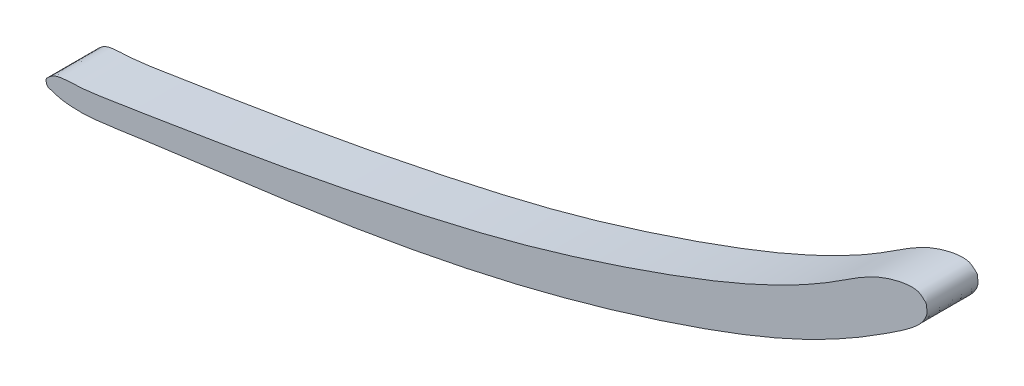
ISO-10303-21;
HEADER;
FILE_DESCRIPTION(('STEP AP214'),'2;1');
FILE_NAME('part.step','',(''),(''),'','','');
FILE_SCHEMA(('AUTOMOTIVE_DESIGN { 1 0 10303 214 1 1 1 1 }'));
ENDSEC;
DATA;
#1=APPLICATION_CONTEXT('core data for automotive mechanical design processes');
#2=APPLICATION_PROTOCOL_DEFINITION('international standard','automotive_design',2000,#1);
#3=PRODUCT_CONTEXT('',#1,'mechanical');
#4=PRODUCT('Part','Part','',(#3));
#5=PRODUCT_RELATED_PRODUCT_CATEGORY('part','',(#4));
#6=PRODUCT_DEFINITION_FORMATION('','',#4);
#7=PRODUCT_DEFINITION_CONTEXT('part definition',#1,'design');
#8=PRODUCT_DEFINITION('design','',#6,#7);
#9=PRODUCT_DEFINITION_SHAPE('','',#8);
#10=(LENGTH_UNIT() NAMED_UNIT(*) SI_UNIT(.MILLI.,.METRE.));
#11=(NAMED_UNIT(*) PLANE_ANGLE_UNIT() SI_UNIT($,.RADIAN.));
#12=(NAMED_UNIT(*) SI_UNIT($,.STERADIAN.) SOLID_ANGLE_UNIT());
#13=UNCERTAINTY_MEASURE_WITH_UNIT(LENGTH_MEASURE(1.E-05),#10,'distance_accuracy_value','');
#14=(GEOMETRIC_REPRESENTATION_CONTEXT(3) GLOBAL_UNCERTAINTY_ASSIGNED_CONTEXT((#13)) GLOBAL_UNIT_ASSIGNED_CONTEXT((#10,
#11,#12)) REPRESENTATION_CONTEXT('',''));
#15=CARTESIAN_POINT('',(0.,0.,0.));
#16=DIRECTION('',(0.,0.,1.));
#17=DIRECTION('',(1.,0.,0.));
#18=AXIS2_PLACEMENT_3D('',#15,#16,#17);
#19=CARTESIAN_POINT('',(83.4912121583516,0.,308.));
#20=CARTESIAN_POINT('',(83.4532867798643,0.0909827646871946,308.));
#21=CARTESIAN_POINT('',(83.3846794221663,0.16157354240682,308.));
#22=CARTESIAN_POINT('',(83.242684122017,0.294381657921899,308.));
#23=CARTESIAN_POINT('',(83.1678538136841,0.356403779828761,308.));
#24=CARTESIAN_POINT('',(82.9472739637766,0.54694173654499,308.));
#25=CARTESIAN_POINT('',(82.8005563729602,0.676143974114221,308.));
#26=CARTESIAN_POINT('',(82.5625786490889,0.840871096492843,308.));
#27=CARTESIAN_POINT('',(82.4806961712847,0.891315206210077,308.));
#28=CARTESIAN_POINT('',(82.3077924977375,0.976243077147167,308.));
#29=CARTESIAN_POINT('',(82.2163311983857,1.0114291448976,308.));
#30=CARTESIAN_POINT('',(81.9358143355176,1.09581030373006,308.));
#31=CARTESIAN_POINT('',(81.7448100150683,1.12364353775783,308.));
#32=CARTESIAN_POINT('',(81.3589412831867,1.15183567737865,308.));
#33=CARTESIAN_POINT('',(81.1635581628754,1.15129929875423,308.));
#34=CARTESIAN_POINT('',(80.7775015296282,1.13603456985938,308.));
#35=CARTESIAN_POINT('',(80.5857067633743,1.12072480895572,308.));
#36=CARTESIAN_POINT('',(80.0136099817647,1.05433460859319,308.));
#37=CARTESIAN_POINT('',(79.6363021866825,0.984618678696754,308.));
#38=CARTESIAN_POINT('',(78.5102545404211,0.738901342460389,308.));
#39=CARTESIAN_POINT('',(77.7670339215163,0.51971837554762,308.));
#40=CARTESIAN_POINT('',(76.3276338511136,0.0059361056997283,308.));
#41=CARTESIAN_POINT('',(75.6277711215128,-0.292402598144494,308.));
#42=CARTESIAN_POINT('',(73.5848403216414,-1.30579723748026,308.));
#43=CARTESIAN_POINT('',(72.2928251707021,-2.12852064267373,308.));
#44=CARTESIAN_POINT('',(70.3640923257504,-3.37826596528115,308.));
#45=CARTESIAN_POINT('',(69.7218398830231,-3.79603143214602,308.));
#46=CARTESIAN_POINT('',(68.4288297865576,-4.61627387627075,308.));
#47=CARTESIAN_POINT('',(67.7787063329545,-5.01989085607263,308.));
#48=CARTESIAN_POINT('',(65.8091934294524,-6.19633223590341,308.));
#49=CARTESIAN_POINT('',(64.471753997392,-6.93671100180345,308.));
#50=CARTESIAN_POINT('',(61.7645519748151,-8.35936623944189,308.));
#51=CARTESIAN_POINT('',(60.3948167823874,-9.04169196044595,308.));
#52=CARTESIAN_POINT('',(57.6308469516567,-10.3623045745968,308.));
#53=CARTESIAN_POINT('',(56.2357991547441,-10.999424696263,308.));
#54=CARTESIAN_POINT('',(53.4273757692444,-12.2263913630353,308.));
#55=CARTESIAN_POINT('',(52.0134629516053,-12.8172282177283,308.));
#56=CARTESIAN_POINT('',(47.7487805717884,-14.5361780702807,308.));
#57=CARTESIAN_POINT('',(44.8798601965009,-15.6143187369691,308.));
#58=CARTESIAN_POINT('',(39.1122570987183,-17.6850859041681,308.));
#59=CARTESIAN_POINT('',(36.2116700142817,-18.6755855898626,308.));
#60=CARTESIAN_POINT('',(30.3858465663811,-20.5815670559842,308.));
#61=CARTESIAN_POINT('',(27.4615814530534,-21.497054940903,308.));
#62=CARTESIAN_POINT('',(21.5826340377719,-23.2275557628624,308.));
#63=CARTESIAN_POINT('',(18.6259302562351,-24.0393737655911,308.));
#64=CARTESIAN_POINT('',(12.6875397694457,-25.557094362804,308.));
#65=CARTESIAN_POINT('',(9.70560086263767,-26.2629716215502,308.));
#66=CARTESIAN_POINT('',(3.72721901976077,-27.6144242042274,308.));
#67=CARTESIAN_POINT('',(0.731194282338575,-28.262039310148,308.));
#68=CARTESIAN_POINT('',(-5.26852693935508,-29.5166454734456,308.));
#69=CARTESIAN_POINT('',(-8.27266366830629,-30.1230698458666,308.));
#70=CARTESIAN_POINT('',(-14.2907326274072,-31.2880907673726,308.));
#71=CARTESIAN_POINT('',(-17.3049274544902,-31.8437250730409,308.));
#72=CARTESIAN_POINT('',(-23.3410594299745,-32.9091148353466,308.));
#73=CARTESIAN_POINT('',(-26.3631067398818,-33.4193294407733,308.));
#74=CARTESIAN_POINT('',(-32.4108122633203,-34.4189874004794,308.));
#75=CARTESIAN_POINT('',(-35.4360718893338,-34.9102743820847,308.));
#76=CARTESIAN_POINT('',(-39.974815344507,-35.6418487208219,308.));
#77=CARTESIAN_POINT('',(-41.4880932417012,-35.8834803456351,308.));
#78=CARTESIAN_POINT('',(-43.759273039026,-36.2378378889827,308.));
#79=CARTESIAN_POINT('',(-44.516407745779,-36.3556243519962,308.));
#80=CARTESIAN_POINT('',(-46.0312473730212,-36.5868956813561,308.));
#81=CARTESIAN_POINT('',(-46.7892314253596,-36.6980755522116,308.));
#82=CARTESIAN_POINT('',(-48.3104616886796,-36.8788800208307,308.));
#83=CARTESIAN_POINT('',(-49.074202318415,-36.9490838847295,308.));
#84=CARTESIAN_POINT('',(-50.2224458418687,-37.0125138057084,308.));
#85=CARTESIAN_POINT('',(-50.6057290776168,-37.0253694452461,308.));
#86=CARTESIAN_POINT('',(-51.3711920766601,-37.0681619813778,308.));
#87=CARTESIAN_POINT('',(-51.7547561780958,-37.0982580050029,308.));
#88=CARTESIAN_POINT('',(-52.5114335024971,-37.2110337131133,308.));
#89=CARTESIAN_POINT('',(-52.8834776932882,-37.2928218381232,308.));
#90=CARTESIAN_POINT('',(-53.4125215026299,-37.5326193046912,308.));
#91=CARTESIAN_POINT('',(-53.5768827998733,-37.6331800756411,308.));
#92=CARTESIAN_POINT('',(-53.8868382805185,-37.8590768028461,308.));
#93=CARTESIAN_POINT('',(-54.0325250055758,-37.9861044967327,308.));
#94=CARTESIAN_POINT('',(-54.2479678102837,-38.179433462166,308.));
#95=CARTESIAN_POINT('',(-54.3191791330717,-38.2452738072848,308.));
#96=CARTESIAN_POINT('',(-54.4109669434364,-38.3565605321139,308.));
#97=CARTESIAN_POINT('',(-54.4389626363028,-38.3968909239866,308.));
#98=CARTESIAN_POINT('',(-54.4803634772818,-38.4835778432258,308.));
#99=CARTESIAN_POINT('',(-54.4931513930416,-38.5309334553159,308.));
#100=CARTESIAN_POINT('',(-54.5089633384086,-38.674766840954,308.));
#101=CARTESIAN_POINT('',(-54.4928049582321,-38.7715588624179,308.));
#102=CARTESIAN_POINT('',(-54.4505607179286,-38.9591594213147,308.));
#103=CARTESIAN_POINT('',(-54.4245586866241,-39.0516553652259,308.));
#104=CARTESIAN_POINT('',(-54.353876750655,-39.2316549051913,308.));
#105=CARTESIAN_POINT('',(-54.3058109211606,-39.3186805388238,308.));
#106=CARTESIAN_POINT('',(-54.199236026553,-39.4157474857262,308.));
#107=CARTESIAN_POINT('',(-54.1578695537671,-39.4425281610623,308.));
#108=CARTESIAN_POINT('',(-54.0710014182618,-39.4837803024544,308.));
#109=CARTESIAN_POINT('',(-54.0256839446919,-39.4993087921217,308.));
#110=CARTESIAN_POINT('',(-53.8878046628719,-39.5406790650407,308.));
#111=CARTESIAN_POINT('',(-53.7940462112595,-39.5632355906695,308.));
#112=CARTESIAN_POINT('',(-53.608977924208,-39.615583342901,308.));
#113=CARTESIAN_POINT('',(-53.5169291995519,-39.6433412767754,308.));
#114=CARTESIAN_POINT('',(-53.2422330028295,-39.7313467603524,308.));
#115=CARTESIAN_POINT('',(-53.0605350811076,-39.7946929588388,308.));
#116=CARTESIAN_POINT('',(-52.6934974906335,-39.9095013150421,308.));
#117=CARTESIAN_POINT('',(-52.5075586370712,-39.9603812367597,308.));
#118=CARTESIAN_POINT('',(-51.9483450903296,-40.0860083367176,308.));
#119=CARTESIAN_POINT('',(-51.573056921684,-40.1411659596429,308.));
#120=CARTESIAN_POINT('',(-50.443505887996,-40.2641193016681,308.));
#121=CARTESIAN_POINT('',(-49.6857826012058,-40.2920033464207,308.));
#122=CARTESIAN_POINT('',(-48.1629220922978,-40.2622608843294,308.));
#123=CARTESIAN_POINT('',(-47.402767229354,-40.2054136761593,308.));
#124=CARTESIAN_POINT('',(-45.8884447741612,-40.0553478149949,308.));
#125=CARTESIAN_POINT('',(-45.1330314359489,-39.9620038250949,308.));
#126=CARTESIAN_POINT('',(-42.8689429971,-39.6594317380198,308.));
#127=CARTESIAN_POINT('',(-41.3628949284365,-39.4337340126056,308.));
#128=CARTESIAN_POINT('',(-38.3487495689712,-38.9972049035244,308.));
#129=CARTESIAN_POINT('',(-36.8410102205974,-38.783573147363,308.));
#130=CARTESIAN_POINT('',(-32.3145359869973,-38.165961783561,308.));
#131=CARTESIAN_POINT('',(-29.2935598335747,-37.7794270604682,308.));
#132=CARTESIAN_POINT('',(-23.253327697027,-36.9934450189986,308.));
#133=CARTESIAN_POINT('',(-20.2340008051575,-36.5947942757681,308.));
#134=CARTESIAN_POINT('',(-11.1855052017771,-35.3308181209158,308.));
#135=CARTESIAN_POINT('',(-5.16514856162024,-34.3957324266248,308.));
#136=CARTESIAN_POINT('',(6.82210244976003,-32.2343441177706,308.));
#137=CARTESIAN_POINT('',(12.7918288874873,-31.0116825375032,308.));
#138=CARTESIAN_POINT('',(24.6411024889613,-28.1952028690295,308.));
#139=CARTESIAN_POINT('',(30.5229769583351,-26.6000547169089,308.));
#140=CARTESIAN_POINT('',(39.2655368058489,-23.9517303403162,308.));
#141=CARTESIAN_POINT('',(42.1682945829716,-23.0263253399831,308.));
#142=CARTESIAN_POINT('',(47.9397514871137,-21.0818515816051,308.));
#143=CARTESIAN_POINT('',(50.8090094985958,-20.063536836132,308.));
#144=CARTESIAN_POINT('',(56.4983954011131,-17.8894604379086,308.));
#145=CARTESIAN_POINT('',(59.3188712254982,-16.7339806002398,308.));
#146=CARTESIAN_POINT('',(64.8651421747803,-14.220117865167,308.));
#147=CARTESIAN_POINT('',(67.5937803541576,-12.8579310502215,308.));
#148=CARTESIAN_POINT('',(72.9206979742782,-9.90227392871127,308.));
#149=CARTESIAN_POINT('',(75.5210774526343,-8.30822155483037,308.));
#150=CARTESIAN_POINT('',(78.6985652240814,-6.20797648682437,308.));
#151=CARTESIAN_POINT('',(79.3307531279343,-5.78245732497108,308.));
#152=CARTESIAN_POINT('',(80.2641329435709,-5.12354476219446,308.));
#153=CARTESIAN_POINT('',(80.5721591589305,-4.89963876361314,308.));
#154=CARTESIAN_POINT('',(81.1777314306535,-4.43739815371735,308.));
#155=CARTESIAN_POINT('',(81.4759336351529,-4.19962719259083,308.));
#156=CARTESIAN_POINT('',(82.046862442694,-3.69947237982639,308.));
#157=CARTESIAN_POINT('',(82.3200523191829,-3.43690040978045,308.));
#158=CARTESIAN_POINT('',(82.8242323529913,-2.86880026733135,308.));
#159=CARTESIAN_POINT('',(83.0553932043971,-2.55873934361128,308.));
#160=CARTESIAN_POINT('',(83.3362435841397,-2.06054822060238,308.));
#161=CARTESIAN_POINT('',(83.4199662203601,-1.8881657997926,308.));
#162=CARTESIAN_POINT('',(83.550317346859,-1.52599626875482,308.));
#163=CARTESIAN_POINT('',(83.5963176871067,-1.34084087125222,308.));
#164=CARTESIAN_POINT('',(83.6179017274213,-0.955581607189905,308.));
#165=CARTESIAN_POINT('',(83.590046425675,-0.762839683665189,308.));
#166=CARTESIAN_POINT('',(83.5538014311725,-0.475633865338596,308.));
#167=CARTESIAN_POINT('',(83.5459689093893,-0.37953720168553,308.));
#168=CARTESIAN_POINT('',(83.5321214021614,-0.187189292374469,308.));
#169=CARTESIAN_POINT('',(83.5291375368388,-0.0909827646871832,308.));
#170=CARTESIAN_POINT('',(83.4912121583516,0.,308.));
#171=B_SPLINE_CURVE_WITH_KNOTS('',3,(#19,#20,#21,#22,#23,#24,#25,#26,#27,#28,#29,#30,#31,#32,
#33,#34,#35,#36,#37,#38,#39,#40,#41,#42,#43,#44,#45,#46,#47,#48,#49,#50,#51,#52,#53,#54,#55,#56,
#57,#58,#59,#60,#61,#62,#63,#64,#65,#66,#67,#68,#69,#70,#71,#72,#73,#74,#75,#76,#77,#78,#79,#80,
#81,#82,#83,#84,#85,#86,#87,#88,#89,#90,#91,#92,#93,#94,#95,#96,#97,#98,#99,#100,#101,#102,#103,
#104,#105,#106,#107,#108,#109,#110,#111,#112,#113,#114,#115,#116,#117,#118,#119,#120,#121,#122,
#123,#124,#125,#126,#127,#128,#129,#130,#131,#132,#133,#134,#135,#136,#137,#138,#139,#140,#141,
#142,#143,#144,#145,#146,#147,#148,#149,#150,#151,#152,#153,#154,#155,#156,#157,#158,#159,#160,
#161,#162,#163,#164,#165,#166,#167,#168,#169,#170),.UNSPECIFIED.,.T.,.F.,(4,2,2,2,2,2,2,2,2,2,2,
2,2,2,2,2,2,2,2,2,2,2,2,2,2,2,2,2,2,2,2,2,2,2,2,2,2,2,2,2,2,2,2,2,2,2,2,2,2,2,2,2,2,2,2,2,2,2,2,
2,2,2,2,2,2,2,2,2,2,2,2,2,2,2,2,4),(0.,0.000976562500000131,0.00195312500000026,
0.00390625000000042,0.00488281250000049,0.00585937500000057,0.0078125000000006,
0.00976562500000062,0.0117187500000006,0.0156250000000007,0.0234375000000008,0.0312500000000009,
0.0468750000000012,0.0546875000000013,0.0625000000000015,0.0781250000000019,0.0937500000000024,
0.109375000000003,0.125000000000003,0.156250000000004,0.187500000000005,0.218750000000006,
0.250000000000007,0.281250000000007,0.312500000000008,0.343750000000009,0.37500000000001,
0.406250000000011,0.437500000000011,0.453125000000012,0.460937500000012,0.468750000000012,
0.476562500000012,0.480468750000012,0.484375000000013,0.488281250000013,0.490234375000013,
0.492187500000013,0.493164062500013,0.493652343750013,0.494140625000013,0.495117187500013,
0.496093750000013,0.497070312500013,0.497558593750013,0.498046875000013,0.499023437500013,
0.500000000000013,0.501953125000013,0.503906250000013,0.507812500000013,0.515625000000012,
0.523437500000012,0.531250000000012,0.546875000000012,0.562500000000011,0.593750000000011,
0.62500000000001,0.687500000000008,0.750000000000007,0.812500000000005,0.843750000000004,
0.875000000000003,0.906250000000003,0.937500000000002,0.968750000000001,0.976562500000001,
0.980468750000001,0.984375000000001,0.98828125,0.9921875,0.994140625,0.99609375,0.998046875,
0.9990234375,1.),.UNSPECIFIED.);
#172=DIRECTION('',(0.,0.,-1.));
#173=VECTOR('',#172,1.);
#174=SURFACE_OF_LINEAR_EXTRUSION('',#171,#173);
#175=CARTESIAN_POINT('',(83.4912121583516,0.,308.));
#176=CARTESIAN_POINT('',(83.5291375368388,-0.0909827646871832,308.));
#177=CARTESIAN_POINT('',(83.5321214021614,-0.187189292374469,308.));
#178=CARTESIAN_POINT('',(83.5459689093893,-0.37953720168553,308.));
#179=CARTESIAN_POINT('',(83.5538014311725,-0.475633865338596,308.));
#180=CARTESIAN_POINT('',(83.590046425675,-0.762839683665189,308.));
#181=CARTESIAN_POINT('',(83.6179017274213,-0.955581607189905,308.));
#182=CARTESIAN_POINT('',(83.5963176871067,-1.34084087125222,308.));
#183=CARTESIAN_POINT('',(83.550317346859,-1.52599626875482,308.));
#184=CARTESIAN_POINT('',(83.4199662203601,-1.8881657997926,308.));
#185=CARTESIAN_POINT('',(83.3362435841397,-2.06054822060238,308.));
#186=CARTESIAN_POINT('',(83.0553932043971,-2.55873934361128,308.));
#187=CARTESIAN_POINT('',(82.8242323529913,-2.86880026733135,308.));
#188=CARTESIAN_POINT('',(82.3200523191829,-3.43690040978045,308.));
#189=CARTESIAN_POINT('',(82.046862442694,-3.69947237982639,308.));
#190=CARTESIAN_POINT('',(81.4759336351529,-4.19962719259083,308.));
#191=CARTESIAN_POINT('',(81.1777314306535,-4.43739815371735,308.));
#192=CARTESIAN_POINT('',(80.5721591589305,-4.89963876361314,308.));
#193=CARTESIAN_POINT('',(80.2641329435709,-5.12354476219446,308.));
#194=CARTESIAN_POINT('',(79.3307531279343,-5.78245732497108,308.));
#195=CARTESIAN_POINT('',(78.6985652240814,-6.20797648682437,308.));
#196=CARTESIAN_POINT('',(75.5210774526343,-8.30822155483037,308.));
#197=CARTESIAN_POINT('',(72.9206979742782,-9.90227392871127,308.));
#198=CARTESIAN_POINT('',(67.5937803541576,-12.8579310502215,308.));
#199=CARTESIAN_POINT('',(64.8651421747803,-14.220117865167,308.));
#200=CARTESIAN_POINT('',(59.3188712254982,-16.7339806002398,308.));
#201=CARTESIAN_POINT('',(56.4983954011131,-17.8894604379086,308.));
#202=CARTESIAN_POINT('',(50.8090094985958,-20.063536836132,308.));
#203=CARTESIAN_POINT('',(47.9397514871137,-21.0818515816051,308.));
#204=CARTESIAN_POINT('',(42.1682945829716,-23.0263253399831,308.));
#205=CARTESIAN_POINT('',(39.2655368058489,-23.9517303403162,308.));
#206=CARTESIAN_POINT('',(30.5229769583351,-26.6000547169089,308.));
#207=CARTESIAN_POINT('',(24.6411024889613,-28.1952028690295,308.));
#208=CARTESIAN_POINT('',(12.7918288874873,-31.0116825375032,308.));
#209=CARTESIAN_POINT('',(6.82210244976003,-32.2343441177706,308.));
#210=CARTESIAN_POINT('',(-5.16514856162024,-34.3957324266248,308.));
#211=CARTESIAN_POINT('',(-11.1855052017771,-35.3308181209158,308.));
#212=CARTESIAN_POINT('',(-20.2340008051575,-36.5947942757681,308.));
#213=CARTESIAN_POINT('',(-23.253327697027,-36.9934450189986,308.));
#214=CARTESIAN_POINT('',(-29.2935598335747,-37.7794270604682,308.));
#215=CARTESIAN_POINT('',(-32.3145359869973,-38.165961783561,308.));
#216=CARTESIAN_POINT('',(-36.8410102205974,-38.783573147363,308.));
#217=CARTESIAN_POINT('',(-38.3487495689712,-38.9972049035244,308.));
#218=CARTESIAN_POINT('',(-41.3628949284365,-39.4337340126056,308.));
#219=CARTESIAN_POINT('',(-42.8689429971,-39.6594317380198,308.));
#220=CARTESIAN_POINT('',(-45.1330314359489,-39.9620038250949,308.));
#221=CARTESIAN_POINT('',(-45.8884447741612,-40.0553478149949,308.));
#222=CARTESIAN_POINT('',(-47.402767229354,-40.2054136761593,308.));
#223=CARTESIAN_POINT('',(-48.1629220922978,-40.2622608843294,308.));
#224=CARTESIAN_POINT('',(-49.6857826012058,-40.2920033464207,308.));
#225=CARTESIAN_POINT('',(-50.443505887996,-40.2641193016681,308.));
#226=CARTESIAN_POINT('',(-51.573056921684,-40.1411659596429,308.));
#227=CARTESIAN_POINT('',(-51.9483450903296,-40.0860083367176,308.));
#228=CARTESIAN_POINT('',(-52.5075586370712,-39.9603812367597,308.));
#229=CARTESIAN_POINT('',(-52.6934974906335,-39.9095013150421,308.));
#230=CARTESIAN_POINT('',(-53.0605350811076,-39.7946929588388,308.));
#231=CARTESIAN_POINT('',(-53.2422330028295,-39.7313467603524,308.));
#232=CARTESIAN_POINT('',(-53.5169291995519,-39.6433412767754,308.));
#233=CARTESIAN_POINT('',(-53.608977924208,-39.615583342901,308.));
#234=CARTESIAN_POINT('',(-53.7940462112595,-39.5632355906695,308.));
#235=CARTESIAN_POINT('',(-53.8878046628719,-39.5406790650407,308.));
#236=CARTESIAN_POINT('',(-54.0256839446919,-39.4993087921217,308.));
#237=CARTESIAN_POINT('',(-54.0710014182618,-39.4837803024544,308.));
#238=CARTESIAN_POINT('',(-54.1578695537671,-39.4425281610623,308.));
#239=CARTESIAN_POINT('',(-54.199236026553,-39.4157474857262,308.));
#240=CARTESIAN_POINT('',(-54.3058109211606,-39.3186805388238,308.));
#241=CARTESIAN_POINT('',(-54.353876750655,-39.2316549051913,308.));
#242=CARTESIAN_POINT('',(-54.4245586866241,-39.0516553652259,308.));
#243=CARTESIAN_POINT('',(-54.4505607179286,-38.9591594213147,308.));
#244=CARTESIAN_POINT('',(-54.4928049582321,-38.7715588624179,308.));
#245=CARTESIAN_POINT('',(-54.5089633384086,-38.674766840954,308.));
#246=CARTESIAN_POINT('',(-54.4931513930416,-38.5309334553159,308.));
#247=CARTESIAN_POINT('',(-54.4803634772818,-38.4835778432258,308.));
#248=CARTESIAN_POINT('',(-54.4389626363028,-38.3968909239866,308.));
#249=CARTESIAN_POINT('',(-54.4109669434364,-38.3565605321139,308.));
#250=CARTESIAN_POINT('',(-54.3191791330717,-38.2452738072848,308.));
#251=CARTESIAN_POINT('',(-54.2479678102837,-38.179433462166,308.));
#252=CARTESIAN_POINT('',(-54.0325250055758,-37.9861044967327,308.));
#253=CARTESIAN_POINT('',(-53.8868382805185,-37.8590768028461,308.));
#254=CARTESIAN_POINT('',(-53.5768827998733,-37.6331800756411,308.));
#255=CARTESIAN_POINT('',(-53.4125215026299,-37.5326193046912,308.));
#256=CARTESIAN_POINT('',(-52.8834776932882,-37.2928218381232,308.));
#257=CARTESIAN_POINT('',(-52.5114335024971,-37.2110337131133,308.));
#258=CARTESIAN_POINT('',(-51.7547561780958,-37.0982580050029,308.));
#259=CARTESIAN_POINT('',(-51.3711920766601,-37.0681619813778,308.));
#260=CARTESIAN_POINT('',(-50.6057290776168,-37.0253694452461,308.));
#261=CARTESIAN_POINT('',(-50.2224458418687,-37.0125138057084,308.));
#262=CARTESIAN_POINT('',(-49.074202318415,-36.9490838847295,308.));
#263=CARTESIAN_POINT('',(-48.3104616886796,-36.8788800208307,308.));
#264=CARTESIAN_POINT('',(-46.7892314253596,-36.6980755522116,308.));
#265=CARTESIAN_POINT('',(-46.0312473730212,-36.5868956813561,308.));
#266=CARTESIAN_POINT('',(-44.516407745779,-36.3556243519962,308.));
#267=CARTESIAN_POINT('',(-43.759273039026,-36.2378378889827,308.));
#268=CARTESIAN_POINT('',(-41.4880932417012,-35.8834803456351,308.));
#269=CARTESIAN_POINT('',(-39.974815344507,-35.6418487208219,308.));
#270=CARTESIAN_POINT('',(-35.4360718893338,-34.9102743820847,308.));
#271=CARTESIAN_POINT('',(-32.4108122633203,-34.4189874004794,308.));
#272=CARTESIAN_POINT('',(-26.3631067398818,-33.4193294407733,308.));
#273=CARTESIAN_POINT('',(-23.3410594299745,-32.9091148353466,308.));
#274=CARTESIAN_POINT('',(-17.3049274544902,-31.8437250730409,308.));
#275=CARTESIAN_POINT('',(-14.2907326274072,-31.2880907673726,308.));
#276=CARTESIAN_POINT('',(-8.27266366830629,-30.1230698458666,308.));
#277=CARTESIAN_POINT('',(-5.26852693935508,-29.5166454734456,308.));
#278=CARTESIAN_POINT('',(0.731194282338575,-28.262039310148,308.));
#279=CARTESIAN_POINT('',(3.72721901976077,-27.6144242042274,308.));
#280=CARTESIAN_POINT('',(9.70560086263767,-26.2629716215502,308.));
#281=CARTESIAN_POINT('',(12.6875397694457,-25.557094362804,308.));
#282=CARTESIAN_POINT('',(18.6259302562351,-24.0393737655911,308.));
#283=CARTESIAN_POINT('',(21.5826340377719,-23.2275557628624,308.));
#284=CARTESIAN_POINT('',(27.4615814530534,-21.497054940903,308.));
#285=CARTESIAN_POINT('',(30.3858465663811,-20.5815670559842,308.));
#286=CARTESIAN_POINT('',(36.2116700142817,-18.6755855898626,308.));
#287=CARTESIAN_POINT('',(39.1122570987183,-17.6850859041681,308.));
#288=CARTESIAN_POINT('',(44.8798601965009,-15.6143187369691,308.));
#289=CARTESIAN_POINT('',(47.7487805717884,-14.5361780702807,308.));
#290=CARTESIAN_POINT('',(52.0134629516053,-12.8172282177283,308.));
#291=CARTESIAN_POINT('',(53.4273757692444,-12.2263913630353,308.));
#292=CARTESIAN_POINT('',(56.2357991547441,-10.999424696263,308.));
#293=CARTESIAN_POINT('',(57.6308469516567,-10.3623045745968,308.));
#294=CARTESIAN_POINT('',(60.3948167823874,-9.04169196044595,308.));
#295=CARTESIAN_POINT('',(61.7645519748151,-8.35936623944189,308.));
#296=CARTESIAN_POINT('',(64.471753997392,-6.93671100180345,308.));
#297=CARTESIAN_POINT('',(65.8091934294524,-6.19633223590341,308.));
#298=CARTESIAN_POINT('',(67.7787063329545,-5.01989085607263,308.));
#299=CARTESIAN_POINT('',(68.4288297865576,-4.61627387627075,308.));
#300=CARTESIAN_POINT('',(69.7218398830231,-3.79603143214602,308.));
#301=CARTESIAN_POINT('',(70.3640923257504,-3.37826596528115,308.));
#302=CARTESIAN_POINT('',(72.2928251707021,-2.12852064267373,308.));
#303=CARTESIAN_POINT('',(73.5848403216414,-1.30579723748026,308.));
#304=CARTESIAN_POINT('',(75.6277711215128,-0.292402598144494,308.));
#305=CARTESIAN_POINT('',(76.3276338511136,0.0059361056997283,308.));
#306=CARTESIAN_POINT('',(77.7670339215163,0.51971837554762,308.));
#307=CARTESIAN_POINT('',(78.5102545404211,0.738901342460389,308.));
#308=CARTESIAN_POINT('',(79.6363021866825,0.984618678696754,308.));
#309=CARTESIAN_POINT('',(80.0136099817647,1.05433460859319,308.));
#310=CARTESIAN_POINT('',(80.5857067633743,1.12072480895572,308.));
#311=CARTESIAN_POINT('',(80.7775015296282,1.13603456985938,308.));
#312=CARTESIAN_POINT('',(81.1635581628754,1.15129929875423,308.));
#313=CARTESIAN_POINT('',(81.3589412831867,1.15183567737865,308.));
#314=CARTESIAN_POINT('',(81.7448100150683,1.12364353775783,308.));
#315=CARTESIAN_POINT('',(81.9358143355176,1.09581030373006,308.));
#316=CARTESIAN_POINT('',(82.2163311983857,1.0114291448976,308.));
#317=CARTESIAN_POINT('',(82.3077924977375,0.976243077147167,308.));
#318=CARTESIAN_POINT('',(82.4806961712847,0.891315206210077,308.));
#319=CARTESIAN_POINT('',(82.5625786490889,0.840871096492843,308.));
#320=CARTESIAN_POINT('',(82.8005563729602,0.676143974114221,308.));
#321=CARTESIAN_POINT('',(82.9472739637766,0.54694173654499,308.));
#322=CARTESIAN_POINT('',(83.1678538136841,0.356403779828761,308.));
#323=CARTESIAN_POINT('',(83.242684122017,0.294381657921899,308.));
#324=CARTESIAN_POINT('',(83.3846794221663,0.16157354240682,308.));
#325=CARTESIAN_POINT('',(83.4532867798643,0.0909827646871946,308.));
#326=CARTESIAN_POINT('',(83.4912121583516,0.,308.));
#327=B_SPLINE_CURVE_WITH_KNOTS('',3,(#175,#176,#177,#178,#179,#180,#181,#182,#183,#184,#185,
#186,#187,#188,#189,#190,#191,#192,#193,#194,#195,#196,#197,#198,#199,#200,#201,#202,#203,#204,
#205,#206,#207,#208,#209,#210,#211,#212,#213,#214,#215,#216,#217,#218,#219,#220,#221,#222,#223,
#224,#225,#226,#227,#228,#229,#230,#231,#232,#233,#234,#235,#236,#237,#238,#239,#240,#241,#242,
#243,#244,#245,#246,#247,#248,#249,#250,#251,#252,#253,#254,#255,#256,#257,#258,#259,#260,#261,
#262,#263,#264,#265,#266,#267,#268,#269,#270,#271,#272,#273,#274,#275,#276,#277,#278,#279,#280,
#281,#282,#283,#284,#285,#286,#287,#288,#289,#290,#291,#292,#293,#294,#295,#296,#297,#298,#299,
#300,#301,#302,#303,#304,#305,#306,#307,#308,#309,#310,#311,#312,#313,#314,#315,#316,#317,#318,
#319,#320,#321,#322,#323,#324,#325,#326),.UNSPECIFIED.,.T.,.F.,(4,2,2,2,2,2,2,2,2,2,2,2,2,2,2,2,
2,2,2,2,2,2,2,2,2,2,2,2,2,2,2,2,2,2,2,2,2,2,2,2,2,2,2,2,2,2,2,2,2,2,2,2,2,2,2,2,2,2,2,2,2,2,2,2,
2,2,2,2,2,2,2,2,2,2,2,4),(0.,0.000976562499999889,0.00195312499999989,0.00390624999999989,
0.00585937499999978,0.00781249999999967,0.0117187499999996,0.0156249999999994,
0.0195312499999993,0.0234374999999991,0.031249999999999,0.0624999999999981,0.0937499999999973,
0.124999999999997,0.156249999999996,0.187499999999995,0.249999999999993,0.312499999999992,
0.37499999999999,0.406249999999989,0.437499999999989,0.453124999999988,0.468749999999988,
0.476562499999988,0.484374999999988,0.492187499999987,0.496093749999987,0.498046874999987,
0.499999999999987,0.500976562499987,0.501953124999987,0.502441406249987,0.502929687499987,
0.503906249999987,0.504882812499987,0.505859374999987,0.506347656249987,0.506835937499987,
0.507812499999987,0.509765624999987,0.511718749999987,0.515624999999987,0.519531249999988,
0.523437499999988,0.531249999999988,0.539062499999988,0.546874999999988,0.562499999999989,
0.593749999999989,0.62499999999999,0.656249999999991,0.687499999999992,0.718749999999992,
0.749999999999993,0.781249999999994,0.812499999999995,0.843749999999996,0.874999999999997,
0.890624999999997,0.906249999999998,0.921874999999998,0.937499999999999,0.945312499999999,
0.953124999999999,0.968749999999999,0.976562499999999,0.984374999999999,0.988281249999999,
0.990234374999999,0.992187499999999,0.994140624999999,0.9951171875,0.99609375,0.998046875,
0.9990234375,1.),.UNSPECIFIED.);
#328=CARTESIAN_POINT('',(83.4912121583516,0.,308.));
#329=VERTEX_POINT('',#328);
#330=EDGE_CURVE('E10',#329,#329,#327,.F.);
#331=ORIENTED_EDGE('',*,*,#330,.F.);
#332=EDGE_LOOP('',(#331));
#333=FACE_BOUND('',#332,.T.);
#334=CARTESIAN_POINT('',(83.4912121583516,0.,300.));
#335=CARTESIAN_POINT('',(83.4532867798643,0.0909827646871946,300.));
#336=CARTESIAN_POINT('',(83.3846794221663,0.16157354240682,300.));
#337=CARTESIAN_POINT('',(83.242684122017,0.294381657921899,300.));
#338=CARTESIAN_POINT('',(83.1678538136841,0.356403779828761,300.));
#339=CARTESIAN_POINT('',(82.9472739637766,0.54694173654499,300.));
#340=CARTESIAN_POINT('',(82.8005563729602,0.676143974114221,300.));
#341=CARTESIAN_POINT('',(82.5625786490889,0.840871096492843,300.));
#342=CARTESIAN_POINT('',(82.4806961712847,0.891315206210077,300.));
#343=CARTESIAN_POINT('',(82.3077924977375,0.976243077147167,300.));
#344=CARTESIAN_POINT('',(82.2163311983857,1.0114291448976,300.));
#345=CARTESIAN_POINT('',(81.9358143355176,1.09581030373006,300.));
#346=CARTESIAN_POINT('',(81.7448100150683,1.12364353775783,300.));
#347=CARTESIAN_POINT('',(81.3589412831867,1.15183567737865,300.));
#348=CARTESIAN_POINT('',(81.1635581628754,1.15129929875423,300.));
#349=CARTESIAN_POINT('',(80.7775015296282,1.13603456985938,300.));
#350=CARTESIAN_POINT('',(80.5857067633743,1.12072480895572,300.));
#351=CARTESIAN_POINT('',(80.0136099817647,1.05433460859319,300.));
#352=CARTESIAN_POINT('',(79.6363021866825,0.984618678696754,300.));
#353=CARTESIAN_POINT('',(78.5102545404211,0.738901342460389,300.));
#354=CARTESIAN_POINT('',(77.7670339215163,0.51971837554762,300.));
#355=CARTESIAN_POINT('',(76.3276338511136,0.0059361056997283,300.));
#356=CARTESIAN_POINT('',(75.6277711215128,-0.292402598144494,300.));
#357=CARTESIAN_POINT('',(73.5848403216414,-1.30579723748026,300.));
#358=CARTESIAN_POINT('',(72.2928251707021,-2.12852064267373,300.));
#359=CARTESIAN_POINT('',(70.3640923257504,-3.37826596528115,300.));
#360=CARTESIAN_POINT('',(69.7218398830231,-3.79603143214602,300.));
#361=CARTESIAN_POINT('',(68.4288297865576,-4.61627387627075,300.));
#362=CARTESIAN_POINT('',(67.7787063329545,-5.01989085607263,300.));
#363=CARTESIAN_POINT('',(65.8091934294524,-6.19633223590341,300.));
#364=CARTESIAN_POINT('',(64.471753997392,-6.93671100180345,300.));
#365=CARTESIAN_POINT('',(61.7645519748151,-8.35936623944189,300.));
#366=CARTESIAN_POINT('',(60.3948167823874,-9.04169196044595,300.));
#367=CARTESIAN_POINT('',(57.6308469516567,-10.3623045745968,300.));
#368=CARTESIAN_POINT('',(56.2357991547441,-10.999424696263,300.));
#369=CARTESIAN_POINT('',(53.4273757692444,-12.2263913630353,300.));
#370=CARTESIAN_POINT('',(52.0134629516053,-12.8172282177283,300.));
#371=CARTESIAN_POINT('',(47.7487805717884,-14.5361780702807,300.));
#372=CARTESIAN_POINT('',(44.8798601965009,-15.6143187369691,300.));
#373=CARTESIAN_POINT('',(39.1122570987183,-17.6850859041681,300.));
#374=CARTESIAN_POINT('',(36.2116700142817,-18.6755855898626,300.));
#375=CARTESIAN_POINT('',(30.3858465663811,-20.5815670559842,300.));
#376=CARTESIAN_POINT('',(27.4615814530534,-21.497054940903,300.));
#377=CARTESIAN_POINT('',(21.5826340377719,-23.2275557628624,300.));
#378=CARTESIAN_POINT('',(18.6259302562351,-24.0393737655911,300.));
#379=CARTESIAN_POINT('',(12.6875397694457,-25.557094362804,300.));
#380=CARTESIAN_POINT('',(9.70560086263767,-26.2629716215502,300.));
#381=CARTESIAN_POINT('',(3.72721901976077,-27.6144242042274,300.));
#382=CARTESIAN_POINT('',(0.731194282338575,-28.262039310148,300.));
#383=CARTESIAN_POINT('',(-5.26852693935508,-29.5166454734456,300.));
#384=CARTESIAN_POINT('',(-8.27266366830629,-30.1230698458666,300.));
#385=CARTESIAN_POINT('',(-14.2907326274072,-31.2880907673726,300.));
#386=CARTESIAN_POINT('',(-17.3049274544902,-31.8437250730409,300.));
#387=CARTESIAN_POINT('',(-23.3410594299745,-32.9091148353466,300.));
#388=CARTESIAN_POINT('',(-26.3631067398818,-33.4193294407733,300.));
#389=CARTESIAN_POINT('',(-32.4108122633203,-34.4189874004794,300.));
#390=CARTESIAN_POINT('',(-35.4360718893338,-34.9102743820847,300.));
#391=CARTESIAN_POINT('',(-39.974815344507,-35.6418487208219,300.));
#392=CARTESIAN_POINT('',(-41.4880932417012,-35.8834803456351,300.));
#393=CARTESIAN_POINT('',(-43.759273039026,-36.2378378889827,300.));
#394=CARTESIAN_POINT('',(-44.516407745779,-36.3556243519962,300.));
#395=CARTESIAN_POINT('',(-46.0312473730212,-36.5868956813561,300.));
#396=CARTESIAN_POINT('',(-46.7892314253596,-36.6980755522116,300.));
#397=CARTESIAN_POINT('',(-48.3104616886796,-36.8788800208307,300.));
#398=CARTESIAN_POINT('',(-49.074202318415,-36.9490838847295,300.));
#399=CARTESIAN_POINT('',(-50.2224458418687,-37.0125138057084,300.));
#400=CARTESIAN_POINT('',(-50.6057290776168,-37.0253694452461,300.));
#401=CARTESIAN_POINT('',(-51.3711920766601,-37.0681619813778,300.));
#402=CARTESIAN_POINT('',(-51.7547561780958,-37.0982580050029,300.));
#403=CARTESIAN_POINT('',(-52.5114335024971,-37.2110337131133,300.));
#404=CARTESIAN_POINT('',(-52.8834776932882,-37.2928218381232,300.));
#405=CARTESIAN_POINT('',(-53.4125215026299,-37.5326193046912,300.));
#406=CARTESIAN_POINT('',(-53.5768827998733,-37.6331800756411,300.));
#407=CARTESIAN_POINT('',(-53.8868382805185,-37.8590768028461,300.));
#408=CARTESIAN_POINT('',(-54.0325250055758,-37.9861044967327,300.));
#409=CARTESIAN_POINT('',(-54.2479678102837,-38.179433462166,300.));
#410=CARTESIAN_POINT('',(-54.3191791330717,-38.2452738072848,300.));
#411=CARTESIAN_POINT('',(-54.4109669434364,-38.3565605321139,300.));
#412=CARTESIAN_POINT('',(-54.4389626363028,-38.3968909239866,300.));
#413=CARTESIAN_POINT('',(-54.4803634772818,-38.4835778432258,300.));
#414=CARTESIAN_POINT('',(-54.4931513930416,-38.5309334553159,300.));
#415=CARTESIAN_POINT('',(-54.5089633384086,-38.674766840954,300.));
#416=CARTESIAN_POINT('',(-54.4928049582321,-38.7715588624179,300.));
#417=CARTESIAN_POINT('',(-54.4505607179286,-38.9591594213147,300.));
#418=CARTESIAN_POINT('',(-54.4245586866241,-39.0516553652259,300.));
#419=CARTESIAN_POINT('',(-54.353876750655,-39.2316549051913,300.));
#420=CARTESIAN_POINT('',(-54.3058109211606,-39.3186805388238,300.));
#421=CARTESIAN_POINT('',(-54.199236026553,-39.4157474857262,300.));
#422=CARTESIAN_POINT('',(-54.1578695537671,-39.4425281610623,300.));
#423=CARTESIAN_POINT('',(-54.0710014182618,-39.4837803024544,300.));
#424=CARTESIAN_POINT('',(-54.0256839446919,-39.4993087921217,300.));
#425=CARTESIAN_POINT('',(-53.8878046628719,-39.5406790650407,300.));
#426=CARTESIAN_POINT('',(-53.7940462112595,-39.5632355906695,300.));
#427=CARTESIAN_POINT('',(-53.608977924208,-39.615583342901,300.));
#428=CARTESIAN_POINT('',(-53.5169291995519,-39.6433412767754,300.));
#429=CARTESIAN_POINT('',(-53.2422330028295,-39.7313467603524,300.));
#430=CARTESIAN_POINT('',(-53.0605350811076,-39.7946929588388,300.));
#431=CARTESIAN_POINT('',(-52.6934974906335,-39.9095013150421,300.));
#432=CARTESIAN_POINT('',(-52.5075586370712,-39.9603812367597,300.));
#433=CARTESIAN_POINT('',(-51.9483450903296,-40.0860083367176,300.));
#434=CARTESIAN_POINT('',(-51.573056921684,-40.1411659596429,300.));
#435=CARTESIAN_POINT('',(-50.443505887996,-40.2641193016681,300.));
#436=CARTESIAN_POINT('',(-49.6857826012058,-40.2920033464207,300.));
#437=CARTESIAN_POINT('',(-48.1629220922978,-40.2622608843294,300.));
#438=CARTESIAN_POINT('',(-47.402767229354,-40.2054136761593,300.));
#439=CARTESIAN_POINT('',(-45.8884447741612,-40.0553478149949,300.));
#440=CARTESIAN_POINT('',(-45.1330314359489,-39.9620038250949,300.));
#441=CARTESIAN_POINT('',(-42.8689429971,-39.6594317380198,300.));
#442=CARTESIAN_POINT('',(-41.3628949284365,-39.4337340126056,300.));
#443=CARTESIAN_POINT('',(-38.3487495689712,-38.9972049035244,300.));
#444=CARTESIAN_POINT('',(-36.8410102205974,-38.783573147363,300.));
#445=CARTESIAN_POINT('',(-32.3145359869973,-38.165961783561,300.));
#446=CARTESIAN_POINT('',(-29.2935598335747,-37.7794270604682,300.));
#447=CARTESIAN_POINT('',(-23.253327697027,-36.9934450189986,300.));
#448=CARTESIAN_POINT('',(-20.2340008051575,-36.5947942757681,300.));
#449=CARTESIAN_POINT('',(-11.1855052017771,-35.3308181209158,300.));
#450=CARTESIAN_POINT('',(-5.16514856162024,-34.3957324266248,300.));
#451=CARTESIAN_POINT('',(6.82210244976003,-32.2343441177706,300.));
#452=CARTESIAN_POINT('',(12.7918288874873,-31.0116825375032,300.));
#453=CARTESIAN_POINT('',(24.6411024889613,-28.1952028690295,300.));
#454=CARTESIAN_POINT('',(30.5229769583351,-26.6000547169089,300.));
#455=CARTESIAN_POINT('',(39.2655368058489,-23.9517303403162,300.));
#456=CARTESIAN_POINT('',(42.1682945829716,-23.0263253399831,300.));
#457=CARTESIAN_POINT('',(47.9397514871137,-21.0818515816051,300.));
#458=CARTESIAN_POINT('',(50.8090094985958,-20.063536836132,300.));
#459=CARTESIAN_POINT('',(56.4983954011131,-17.8894604379086,300.));
#460=CARTESIAN_POINT('',(59.3188712254982,-16.7339806002398,300.));
#461=CARTESIAN_POINT('',(64.8651421747803,-14.220117865167,300.));
#462=CARTESIAN_POINT('',(67.5937803541576,-12.8579310502215,300.));
#463=CARTESIAN_POINT('',(72.9206979742782,-9.90227392871127,300.));
#464=CARTESIAN_POINT('',(75.5210774526343,-8.30822155483037,300.));
#465=CARTESIAN_POINT('',(78.6985652240814,-6.20797648682437,300.));
#466=CARTESIAN_POINT('',(79.3307531279343,-5.78245732497108,300.));
#467=CARTESIAN_POINT('',(80.2641329435709,-5.12354476219446,300.));
#468=CARTESIAN_POINT('',(80.5721591589305,-4.89963876361314,300.));
#469=CARTESIAN_POINT('',(81.1777314306535,-4.43739815371735,300.));
#470=CARTESIAN_POINT('',(81.4759336351529,-4.19962719259083,300.));
#471=CARTESIAN_POINT('',(82.046862442694,-3.69947237982639,300.));
#472=CARTESIAN_POINT('',(82.3200523191829,-3.43690040978045,300.));
#473=CARTESIAN_POINT('',(82.8242323529913,-2.86880026733135,300.));
#474=CARTESIAN_POINT('',(83.0553932043971,-2.55873934361128,300.));
#475=CARTESIAN_POINT('',(83.3362435841397,-2.06054822060238,300.));
#476=CARTESIAN_POINT('',(83.4199662203601,-1.8881657997926,300.));
#477=CARTESIAN_POINT('',(83.550317346859,-1.52599626875482,300.));
#478=CARTESIAN_POINT('',(83.5963176871067,-1.34084087125222,300.));
#479=CARTESIAN_POINT('',(83.6179017274213,-0.955581607189905,300.));
#480=CARTESIAN_POINT('',(83.590046425675,-0.762839683665189,300.));
#481=CARTESIAN_POINT('',(83.5538014311725,-0.475633865338596,300.));
#482=CARTESIAN_POINT('',(83.5459689093893,-0.37953720168553,300.));
#483=CARTESIAN_POINT('',(83.5321214021614,-0.187189292374469,300.));
#484=CARTESIAN_POINT('',(83.5291375368388,-0.0909827646871832,300.));
#485=CARTESIAN_POINT('',(83.4912121583516,0.,300.));
#486=B_SPLINE_CURVE_WITH_KNOTS('',3,(#334,#335,#336,#337,#338,#339,#340,#341,#342,#343,#344,
#345,#346,#347,#348,#349,#350,#351,#352,#353,#354,#355,#356,#357,#358,#359,#360,#361,#362,#363,
#364,#365,#366,#367,#368,#369,#370,#371,#372,#373,#374,#375,#376,#377,#378,#379,#380,#381,#382,
#383,#384,#385,#386,#387,#388,#389,#390,#391,#392,#393,#394,#395,#396,#397,#398,#399,#400,#401,
#402,#403,#404,#405,#406,#407,#408,#409,#410,#411,#412,#413,#414,#415,#416,#417,#418,#419,#420,
#421,#422,#423,#424,#425,#426,#427,#428,#429,#430,#431,#432,#433,#434,#435,#436,#437,#438,#439,
#440,#441,#442,#443,#444,#445,#446,#447,#448,#449,#450,#451,#452,#453,#454,#455,#456,#457,#458,
#459,#460,#461,#462,#463,#464,#465,#466,#467,#468,#469,#470,#471,#472,#473,#474,#475,#476,#477,
#478,#479,#480,#481,#482,#483,#484,#485),.UNSPECIFIED.,.T.,.F.,(4,2,2,2,2,2,2,2,2,2,2,2,2,2,2,2,
2,2,2,2,2,2,2,2,2,2,2,2,2,2,2,2,2,2,2,2,2,2,2,2,2,2,2,2,2,2,2,2,2,2,2,2,2,2,2,2,2,2,2,2,2,2,2,2,
2,2,2,2,2,2,2,2,2,2,2,4),(0.,0.000976562500000131,0.00195312500000026,0.00390625000000042,
0.00488281250000049,0.00585937500000057,0.0078125000000006,0.00976562500000062,
0.0117187500000006,0.0156250000000007,0.0234375000000008,0.0312500000000009,0.0468750000000012,
0.0546875000000013,0.0625000000000015,0.0781250000000019,0.0937500000000024,0.109375000000003,
0.125000000000003,0.156250000000004,0.187500000000005,0.218750000000006,0.250000000000007,
0.281250000000007,0.312500000000008,0.343750000000009,0.37500000000001,0.406250000000011,
0.437500000000011,0.453125000000012,0.460937500000012,0.468750000000012,0.476562500000012,
0.480468750000012,0.484375000000013,0.488281250000013,0.490234375000013,0.492187500000013,
0.493164062500013,0.493652343750013,0.494140625000013,0.495117187500013,0.496093750000013,
0.497070312500013,0.497558593750013,0.498046875000013,0.499023437500013,0.500000000000013,
0.501953125000013,0.503906250000013,0.507812500000013,0.515625000000012,0.523437500000012,
0.531250000000012,0.546875000000012,0.562500000000011,0.593750000000011,0.62500000000001,
0.687500000000008,0.750000000000007,0.812500000000005,0.843750000000004,0.875000000000003,
0.906250000000003,0.937500000000002,0.968750000000001,0.976562500000001,0.980468750000001,
0.984375000000001,0.98828125,0.9921875,0.994140625,0.99609375,0.998046875,0.9990234375,1.),.UNSPECIFIED.);
#487=CARTESIAN_POINT('',(83.4912121583516,0.,300.));
#488=VERTEX_POINT('',#487);
#489=EDGE_CURVE('E38',#488,#488,#486,.T.);
#490=ORIENTED_EDGE('',*,*,#489,.T.);
#491=EDGE_LOOP('',(#490));
#492=FACE_BOUND('',#491,.T.);
#493=ADVANCED_FACE('F28',(#333,#492),#174,.F.);
#494=CARTESIAN_POINT('',(-53.4253638006481,-39.6726764379666,308.));
#495=DIRECTION('',(0.,0.,-1.));
#496=DIRECTION('',(-1.,0.,0.));
#497=AXIS2_PLACEMENT_3D('',#494,#495,#496);
#498=PLANE('',#497);
#499=ORIENTED_EDGE('',*,*,#330,.T.);
#500=EDGE_LOOP('',(#499));
#501=FACE_BOUND('',#500,.T.);
#502=ADVANCED_FACE('F69',(#501),#498,.F.);
#503=CARTESIAN_POINT('',(-53.4253638006481,-39.6726764379666,300.));
#504=DIRECTION('',(0.,0.,-1.));
#505=DIRECTION('',(-1.,0.,0.));
#506=AXIS2_PLACEMENT_3D('',#503,#504,#505);
#507=PLANE('',#506);
#508=ORIENTED_EDGE('',*,*,#489,.F.);
#509=EDGE_LOOP('',(#508));
#510=FACE_BOUND('',#509,.T.);
#511=ADVANCED_FACE('F77',(#510),#507,.T.);
#512=CLOSED_SHELL('',(#493,#502,#511));
#513=MANIFOLD_SOLID_BREP('B2',#512);
#514=ADVANCED_BREP_SHAPE_REPRESENTATION('',(#18,#513),#14);
#515=SHAPE_DEFINITION_REPRESENTATION(#9,#514);
ENDSEC;
END-ISO-10303-21;
